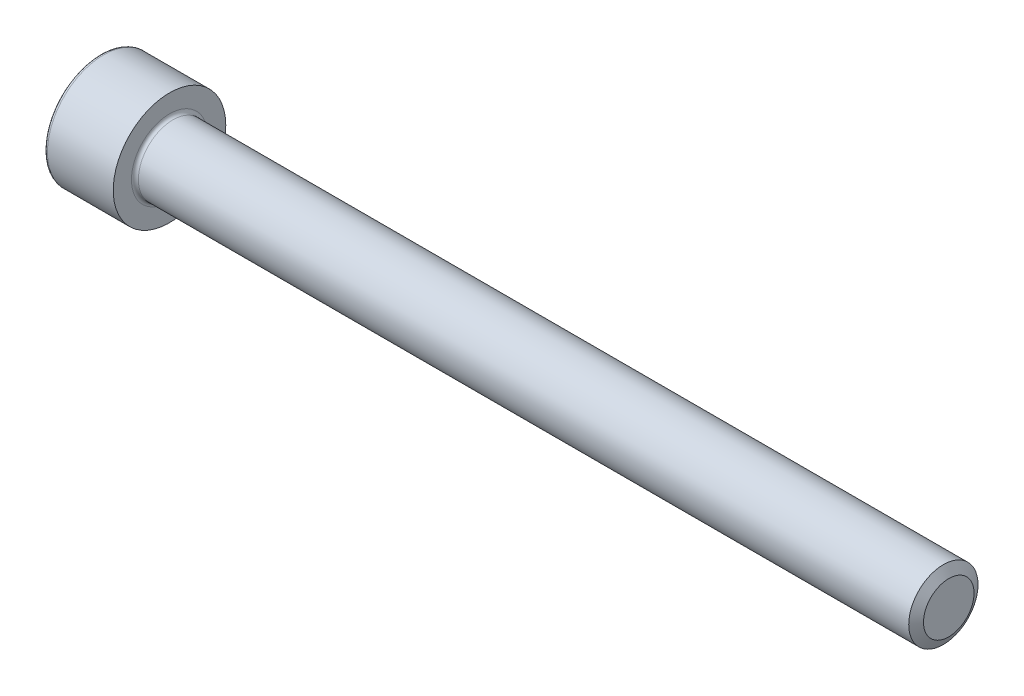
ISO-10303-21;
HEADER;
FILE_DESCRIPTION(('STEP AP214'),'2;1');
FILE_NAME('part.step','',(''),(''),'','','');
FILE_SCHEMA(('AUTOMOTIVE_DESIGN { 1 0 10303 214 1 1 1 1 }'));
ENDSEC;
DATA;
#1=APPLICATION_CONTEXT('core data for automotive mechanical design processes');
#2=APPLICATION_PROTOCOL_DEFINITION('international standard','automotive_design',2000,#1);
#3=PRODUCT_CONTEXT('',#1,'mechanical');
#4=PRODUCT('Part','Part','',(#3));
#5=PRODUCT_RELATED_PRODUCT_CATEGORY('part','',(#4));
#6=PRODUCT_DEFINITION_FORMATION('','',#4);
#7=PRODUCT_DEFINITION_CONTEXT('part definition',#1,'design');
#8=PRODUCT_DEFINITION('design','',#6,#7);
#9=PRODUCT_DEFINITION_SHAPE('','',#8);
#10=(LENGTH_UNIT() NAMED_UNIT(*) SI_UNIT(.MILLI.,.METRE.));
#11=(NAMED_UNIT(*) PLANE_ANGLE_UNIT() SI_UNIT($,.RADIAN.));
#12=(NAMED_UNIT(*) SI_UNIT($,.STERADIAN.) SOLID_ANGLE_UNIT());
#13=UNCERTAINTY_MEASURE_WITH_UNIT(LENGTH_MEASURE(1.E-05),#10,'distance_accuracy_value','');
#14=(GEOMETRIC_REPRESENTATION_CONTEXT(3) GLOBAL_UNCERTAINTY_ASSIGNED_CONTEXT((#13)) GLOBAL_UNIT_ASSIGNED_CONTEXT((#10,
#11,#12)) REPRESENTATION_CONTEXT('',''));
#15=CARTESIAN_POINT('',(0.,0.,0.));
#16=DIRECTION('',(0.,0.,1.));
#17=DIRECTION('',(1.,0.,0.));
#18=AXIS2_PLACEMENT_3D('',#15,#16,#17);
#19=CARTESIAN_POINT('',(0.,0.,0.));
#20=DIRECTION('',(1.,0.,0.));
#21=DIRECTION('',(0.,0.,-1.));
#22=AXIS2_PLACEMENT_3D('',#19,#20,#21);
#23=CYLINDRICAL_SURFACE('',#22,4.);
#24=CARTESIAN_POINT('',(8.4,0.,0.));
#25=DIRECTION('',(1.,0.,0.));
#26=DIRECTION('',(0.,0.,-1.));
#27=AXIS2_PLACEMENT_3D('',#24,#25,#26);
#28=CIRCLE('',#27,4.);
#29=CARTESIAN_POINT('',(8.4,0.,-4.));
#30=VERTEX_POINT('',#29);
#31=EDGE_CURVE('E120',#30,#30,#28,.T.);
#32=ORIENTED_EDGE('',*,*,#31,.T.);
#33=EDGE_LOOP('',(#32));
#34=FACE_BOUND('',#33,.T.);
#35=CARTESIAN_POINT('',(97.375,0.,0.));
#36=DIRECTION('',(-1.,0.,0.));
#37=DIRECTION('',(0.,0.,1.));
#38=AXIS2_PLACEMENT_3D('',#35,#36,#37);
#39=CIRCLE('',#38,4.);
#40=CARTESIAN_POINT('',(97.375,0.,4.));
#41=VERTEX_POINT('',#40);
#42=EDGE_CURVE('E309',#41,#41,#39,.T.);
#43=ORIENTED_EDGE('',*,*,#42,.T.);
#44=EDGE_LOOP('',(#43));
#45=FACE_BOUND('',#44,.T.);
#46=ADVANCED_FACE('F17',(#34,#45),#23,.T.);
#47=CARTESIAN_POINT('',(0.,0.,0.));
#48=DIRECTION('',(-1.,0.,0.));
#49=DIRECTION('',(0.,0.,1.));
#50=AXIS2_PLACEMENT_3D('',#47,#48,#49);
#51=PLANE('',#50);
#52=CARTESIAN_POINT('',(0.,0.,0.));
#53=DIRECTION('',(-1.,0.,0.));
#54=DIRECTION('',(0.,0.,1.));
#55=AXIS2_PLACEMENT_3D('',#52,#53,#54);
#56=CIRCLE('',#55,6.1);
#57=CARTESIAN_POINT('',(0.,0.,6.1));
#58=VERTEX_POINT('',#57);
#59=EDGE_CURVE('E11',#58,#58,#56,.T.);
#60=ORIENTED_EDGE('',*,*,#59,.T.);
#61=EDGE_LOOP('',(#60));
#62=FACE_BOUND('',#61,.T.);
#63=DIRECTION('',(0.,0.5,0.866025403784439));
#64=VECTOR('',#63,1.);
#65=CARTESIAN_POINT('',(0.,-3.43,0.));
#66=LINE('',#65,#64);
#67=CARTESIAN_POINT('',(0.,-3.43,0.));
#68=VERTEX_POINT('',#67);
#69=CARTESIAN_POINT('',(0.,-1.715,2.97046713498062));
#70=VERTEX_POINT('',#69);
#71=EDGE_CURVE('E32',#68,#70,#66,.T.);
#72=ORIENTED_EDGE('',*,*,#71,.F.);
#73=DIRECTION('',(0.,-0.5,0.866025403784439));
#74=VECTOR('',#73,1.);
#75=CARTESIAN_POINT('',(0.,-1.715,-2.97046713498062));
#76=LINE('',#75,#74);
#77=CARTESIAN_POINT('',(0.,-1.715,-2.97046713498062));
#78=VERTEX_POINT('',#77);
#79=EDGE_CURVE('E116',#78,#68,#76,.T.);
#80=ORIENTED_EDGE('',*,*,#79,.F.);
#81=DIRECTION('',(0.,-1.,0.));
#82=VECTOR('',#81,1.);
#83=CARTESIAN_POINT('',(0.,1.715,-2.97046713498062));
#84=LINE('',#83,#82);
#85=CARTESIAN_POINT('',(0.,1.715,-2.97046713498062));
#86=VERTEX_POINT('',#85);
#87=EDGE_CURVE('E114',#86,#78,#84,.T.);
#88=ORIENTED_EDGE('',*,*,#87,.F.);
#89=DIRECTION('',(0.,-0.5,-0.866025403784439));
#90=VECTOR('',#89,1.);
#91=CARTESIAN_POINT('',(0.,3.43,0.));
#92=LINE('',#91,#90);
#93=CARTESIAN_POINT('',(0.,3.43,0.));
#94=VERTEX_POINT('',#93);
#95=EDGE_CURVE('E80',#94,#86,#92,.T.);
#96=ORIENTED_EDGE('',*,*,#95,.F.);
#97=DIRECTION('',(0.,0.5,-0.866025403784439));
#98=VECTOR('',#97,1.);
#99=CARTESIAN_POINT('',(0.,1.715,2.97046713498062));
#100=LINE('',#99,#98);
#101=CARTESIAN_POINT('',(0.,1.715,2.97046713498062));
#102=VERTEX_POINT('',#101);
#103=EDGE_CURVE('E110',#102,#94,#100,.T.);
#104=ORIENTED_EDGE('',*,*,#103,.F.);
#105=DIRECTION('',(0.,1.,0.));
#106=VECTOR('',#105,1.);
#107=CARTESIAN_POINT('',(0.,-1.715,2.97046713498062));
#108=LINE('',#107,#106);
#109=EDGE_CURVE('E106',#70,#102,#108,.T.);
#110=ORIENTED_EDGE('',*,*,#109,.F.);
#111=EDGE_LOOP('',(#72,#80,#88,#96,#104,#110));
#112=FACE_BOUND('',#111,.T.);
#113=ADVANCED_FACE('F156',(#62,#112),#51,.T.);
#114=CARTESIAN_POINT('',(0.,0.,0.));
#115=DIRECTION('',(1.,0.,0.));
#116=DIRECTION('',(0.,0.,-1.));
#117=AXIS2_PLACEMENT_3D('',#114,#115,#116);
#118=CYLINDRICAL_SURFACE('',#117,6.5);
#119=CARTESIAN_POINT('',(0.4,0.,0.));
#120=DIRECTION('',(-1.,0.,0.));
#121=DIRECTION('',(0.,0.,1.));
#122=AXIS2_PLACEMENT_3D('',#119,#120,#121);
#123=CIRCLE('',#122,6.5);
#124=CARTESIAN_POINT('',(0.4,0.,6.5));
#125=VERTEX_POINT('',#124);
#126=EDGE_CURVE('E25',#125,#125,#123,.F.);
#127=ORIENTED_EDGE('',*,*,#126,.T.);
#128=EDGE_LOOP('',(#127));
#129=FACE_BOUND('',#128,.T.);
#130=CARTESIAN_POINT('',(8.,0.,0.));
#131=DIRECTION('',(1.,0.,0.));
#132=DIRECTION('',(0.,0.,-1.));
#133=AXIS2_PLACEMENT_3D('',#130,#131,#132);
#134=CIRCLE('',#133,6.5);
#135=CARTESIAN_POINT('',(8.,0.,-6.5));
#136=VERTEX_POINT('',#135);
#137=EDGE_CURVE('E131',#136,#136,#134,.T.);
#138=ORIENTED_EDGE('',*,*,#137,.F.);
#139=EDGE_LOOP('',(#138));
#140=FACE_BOUND('',#139,.T.);
#141=ADVANCED_FACE('F137',(#129,#140),#118,.T.);
#142=CARTESIAN_POINT('',(8.,6.5,0.));
#143=DIRECTION('',(1.,0.,0.));
#144=DIRECTION('',(0.,0.,-1.));
#145=AXIS2_PLACEMENT_3D('',#142,#143,#144);
#146=PLANE('',#145);
#147=ORIENTED_EDGE('',*,*,#137,.T.);
#148=EDGE_LOOP('',(#147));
#149=FACE_BOUND('',#148,.T.);
#150=CARTESIAN_POINT('',(8.,0.,0.));
#151=DIRECTION('',(1.,0.,0.));
#152=DIRECTION('',(0.,0.,-1.));
#153=AXIS2_PLACEMENT_3D('',#150,#151,#152);
#154=CIRCLE('',#153,4.4);
#155=CARTESIAN_POINT('',(8.,0.,-4.4));
#156=VERTEX_POINT('',#155);
#157=EDGE_CURVE('E128',#156,#156,#154,.T.);
#158=ORIENTED_EDGE('',*,*,#157,.F.);
#159=EDGE_LOOP('',(#158));
#160=FACE_BOUND('',#159,.T.);
#161=ADVANCED_FACE('F173',(#149,#160),#146,.T.);
#162=CARTESIAN_POINT('',(8.4,0.,0.));
#163=DIRECTION('',(1.,0.,0.));
#164=DIRECTION('',(0.,0.,-1.));
#165=AXIS2_PLACEMENT_3D('',#162,#163,#164);
#166=TOROIDAL_SURFACE('',#165,4.4,0.4);
#167=ORIENTED_EDGE('',*,*,#157,.T.);
#168=EDGE_LOOP('',(#167));
#169=FACE_BOUND('',#168,.T.);
#170=ORIENTED_EDGE('',*,*,#31,.F.);
#171=EDGE_LOOP('',(#170));
#172=FACE_BOUND('',#171,.T.);
#173=ADVANCED_FACE('F169',(#169,#172),#166,.F.);
#174=CARTESIAN_POINT('',(4.,-3.43,0.));
#175=DIRECTION('',(0.,-0.866025403784439,0.5));
#176=DIRECTION('',(0.,-0.5,-0.866025403784439));
#177=AXIS2_PLACEMENT_3D('',#174,#175,#176);
#178=PLANE('',#177);
#179=ORIENTED_EDGE('',*,*,#71,.T.);
#180=DIRECTION('',(-1.,0.,0.));
#181=VECTOR('',#180,1.);
#182=CARTESIAN_POINT('',(4.,-1.715,2.97046713498062));
#183=LINE('',#182,#181);
#184=CARTESIAN_POINT('',(4.,-1.715,2.97046713498062));
#185=VERTEX_POINT('',#184);
#186=EDGE_CURVE('E62',#185,#70,#183,.T.);
#187=ORIENTED_EDGE('',*,*,#186,.F.);
#188=DIRECTION('',(0.,0.5,0.866025403784439));
#189=VECTOR('',#188,1.);
#190=CARTESIAN_POINT('',(4.,-3.43,0.));
#191=LINE('',#190,#189);
#192=CARTESIAN_POINT('',(4.,-3.43,0.));
#193=VERTEX_POINT('',#192);
#194=EDGE_CURVE('E118',#193,#185,#191,.T.);
#195=ORIENTED_EDGE('',*,*,#194,.F.);
#196=DIRECTION('',(-1.,0.,0.));
#197=VECTOR('',#196,1.);
#198=CARTESIAN_POINT('',(4.,-3.43,0.));
#199=LINE('',#198,#197);
#200=EDGE_CURVE('E40',#193,#68,#199,.T.);
#201=ORIENTED_EDGE('',*,*,#200,.T.);
#202=EDGE_LOOP('',(#179,#187,#195,#201));
#203=FACE_BOUND('',#202,.T.);
#204=ADVANCED_FACE('F172',(#203),#178,.F.);
#205=CARTESIAN_POINT('',(4.,-1.715,-2.97046713498062));
#206=DIRECTION('',(0.,-0.866025403784439,-0.5));
#207=DIRECTION('',(0.,0.5,-0.866025403784439));
#208=AXIS2_PLACEMENT_3D('',#205,#206,#207);
#209=PLANE('',#208);
#210=ORIENTED_EDGE('',*,*,#79,.T.);
#211=ORIENTED_EDGE('',*,*,#200,.F.);
#212=DIRECTION('',(0.,-0.5,0.866025403784439));
#213=VECTOR('',#212,1.);
#214=CARTESIAN_POINT('',(4.,-1.715,-2.97046713498062));
#215=LINE('',#214,#213);
#216=CARTESIAN_POINT('',(4.,-1.715,-2.97046713498062));
#217=VERTEX_POINT('',#216);
#218=EDGE_CURVE('E92',#217,#193,#215,.T.);
#219=ORIENTED_EDGE('',*,*,#218,.F.);
#220=DIRECTION('',(-1.,0.,0.));
#221=VECTOR('',#220,1.);
#222=CARTESIAN_POINT('',(4.,-1.715,-2.97046713498062));
#223=LINE('',#222,#221);
#224=EDGE_CURVE('E84',#217,#78,#223,.T.);
#225=ORIENTED_EDGE('',*,*,#224,.T.);
#226=EDGE_LOOP('',(#210,#211,#219,#225));
#227=FACE_BOUND('',#226,.T.);
#228=ADVANCED_FACE('F205',(#227),#209,.F.);
#229=CARTESIAN_POINT('',(4.,1.715,-2.97046713498062));
#230=DIRECTION('',(0.,0.,-1.));
#231=DIRECTION('',(0.,1.,0.));
#232=AXIS2_PLACEMENT_3D('',#229,#230,#231);
#233=PLANE('',#232);
#234=ORIENTED_EDGE('',*,*,#87,.T.);
#235=ORIENTED_EDGE('',*,*,#224,.F.);
#236=DIRECTION('',(0.,-1.,0.));
#237=VECTOR('',#236,1.);
#238=CARTESIAN_POINT('',(4.,1.715,-2.97046713498062));
#239=LINE('',#238,#237);
#240=CARTESIAN_POINT('',(4.,1.715,-2.97046713498062));
#241=VERTEX_POINT('',#240);
#242=EDGE_CURVE('E88',#241,#217,#239,.T.);
#243=ORIENTED_EDGE('',*,*,#242,.F.);
#244=DIRECTION('',(-1.,0.,0.));
#245=VECTOR('',#244,1.);
#246=CARTESIAN_POINT('',(4.,1.715,-2.97046713498062));
#247=LINE('',#246,#245);
#248=EDGE_CURVE('E73',#241,#86,#247,.T.);
#249=ORIENTED_EDGE('',*,*,#248,.T.);
#250=EDGE_LOOP('',(#234,#235,#243,#249));
#251=FACE_BOUND('',#250,.T.);
#252=ADVANCED_FACE('F89',(#251),#233,.F.);
#253=CARTESIAN_POINT('',(4.,3.43,0.));
#254=DIRECTION('',(0.,0.866025403784439,-0.5));
#255=DIRECTION('',(0.,0.5,0.866025403784439));
#256=AXIS2_PLACEMENT_3D('',#253,#254,#255);
#257=PLANE('',#256);
#258=ORIENTED_EDGE('',*,*,#95,.T.);
#259=ORIENTED_EDGE('',*,*,#248,.F.);
#260=DIRECTION('',(0.,-0.5,-0.866025403784439));
#261=VECTOR('',#260,1.);
#262=CARTESIAN_POINT('',(4.,3.43,0.));
#263=LINE('',#262,#261);
#264=CARTESIAN_POINT('',(4.,3.43,0.));
#265=VERTEX_POINT('',#264);
#266=EDGE_CURVE('E77',#265,#241,#263,.T.);
#267=ORIENTED_EDGE('',*,*,#266,.F.);
#268=DIRECTION('',(-1.,0.,0.));
#269=VECTOR('',#268,1.);
#270=CARTESIAN_POINT('',(4.,3.43,0.));
#271=LINE('',#270,#269);
#272=EDGE_CURVE('E85',#265,#94,#271,.T.);
#273=ORIENTED_EDGE('',*,*,#272,.T.);
#274=EDGE_LOOP('',(#258,#259,#267,#273));
#275=FACE_BOUND('',#274,.T.);
#276=ADVANCED_FACE('F75',(#275),#257,.F.);
#277=CARTESIAN_POINT('',(4.,1.715,2.97046713498062));
#278=DIRECTION('',(0.,0.866025403784439,0.5));
#279=DIRECTION('',(0.,-0.5,0.866025403784439));
#280=AXIS2_PLACEMENT_3D('',#277,#278,#279);
#281=PLANE('',#280);
#282=ORIENTED_EDGE('',*,*,#103,.T.);
#283=ORIENTED_EDGE('',*,*,#272,.F.);
#284=DIRECTION('',(0.,0.5,-0.866025403784439));
#285=VECTOR('',#284,1.);
#286=CARTESIAN_POINT('',(4.,1.715,2.97046713498062));
#287=LINE('',#286,#285);
#288=CARTESIAN_POINT('',(4.,1.715,2.97046713498062));
#289=VERTEX_POINT('',#288);
#290=EDGE_CURVE('E98',#289,#265,#287,.T.);
#291=ORIENTED_EDGE('',*,*,#290,.F.);
#292=DIRECTION('',(-1.,0.,0.));
#293=VECTOR('',#292,1.);
#294=CARTESIAN_POINT('',(4.,1.715,2.97046713498062));
#295=LINE('',#294,#293);
#296=EDGE_CURVE('E123',#289,#102,#295,.T.);
#297=ORIENTED_EDGE('',*,*,#296,.T.);
#298=EDGE_LOOP('',(#282,#283,#291,#297));
#299=FACE_BOUND('',#298,.T.);
#300=ADVANCED_FACE('F226',(#299),#281,.F.);
#301=CARTESIAN_POINT('',(4.,-1.715,2.97046713498062));
#302=DIRECTION('',(0.,0.,1.));
#303=DIRECTION('',(0.,-1.,0.));
#304=AXIS2_PLACEMENT_3D('',#301,#302,#303);
#305=PLANE('',#304);
#306=ORIENTED_EDGE('',*,*,#109,.T.);
#307=ORIENTED_EDGE('',*,*,#296,.F.);
#308=DIRECTION('',(0.,1.,0.));
#309=VECTOR('',#308,1.);
#310=CARTESIAN_POINT('',(4.,-1.715,2.97046713498062));
#311=LINE('',#310,#309);
#312=EDGE_CURVE('E100',#185,#289,#311,.T.);
#313=ORIENTED_EDGE('',*,*,#312,.F.);
#314=ORIENTED_EDGE('',*,*,#186,.T.);
#315=EDGE_LOOP('',(#306,#307,#313,#314));
#316=FACE_BOUND('',#315,.T.);
#317=ADVANCED_FACE('F152',(#316),#305,.F.);
#318=CARTESIAN_POINT('',(4.,-1.715,2.97046713498062));
#319=DIRECTION('',(-1.,0.,0.));
#320=DIRECTION('',(0.,0.,1.));
#321=AXIS2_PLACEMENT_3D('',#318,#319,#320);
#322=PLANE('',#321);
#323=ORIENTED_EDGE('',*,*,#194,.T.);
#324=ORIENTED_EDGE('',*,*,#312,.T.);
#325=ORIENTED_EDGE('',*,*,#290,.T.);
#326=ORIENTED_EDGE('',*,*,#266,.T.);
#327=ORIENTED_EDGE('',*,*,#242,.T.);
#328=ORIENTED_EDGE('',*,*,#218,.T.);
#329=EDGE_LOOP('',(#323,#324,#325,#326,#327,#328));
#330=FACE_BOUND('',#329,.T.);
#331=ADVANCED_FACE('F95',(#330),#322,.T.);
#332=CARTESIAN_POINT('',(0.4,0.,0.));
#333=DIRECTION('',(-1.,0.,0.));
#334=DIRECTION('',(0.,0.,1.));
#335=AXIS2_PLACEMENT_3D('',#332,#333,#334);
#336=TOROIDAL_SURFACE('',#335,6.1,0.4);
#337=ORIENTED_EDGE('',*,*,#59,.F.);
#338=EDGE_LOOP('',(#337));
#339=FACE_BOUND('',#338,.T.);
#340=ORIENTED_EDGE('',*,*,#126,.F.);
#341=EDGE_LOOP('',(#340));
#342=FACE_BOUND('',#341,.T.);
#343=ADVANCED_FACE('F19',(#339,#342),#336,.T.);
#344=CARTESIAN_POINT('',(97.375,0.,0.));
#345=DIRECTION('',(-1.,0.,0.));
#346=DIRECTION('',(0.,0.,1.));
#347=AXIS2_PLACEMENT_3D('',#344,#345,#346);
#348=CONICAL_SURFACE('',#347,4.,1.04718484902493);
#349=CARTESIAN_POINT('',(98.,0.,0.));
#350=DIRECTION('',(-1.,0.,0.));
#351=DIRECTION('',(0.,0.,1.));
#352=AXIS2_PLACEMENT_3D('',#349,#350,#351);
#353=CIRCLE('',#352,2.9175);
#354=CARTESIAN_POINT('',(98.,0.,2.9175));
#355=VERTEX_POINT('',#354);
#356=EDGE_CURVE('E107',#355,#355,#353,.T.);
#357=ORIENTED_EDGE('',*,*,#356,.T.);
#358=EDGE_LOOP('',(#357));
#359=FACE_BOUND('',#358,.T.);
#360=ORIENTED_EDGE('',*,*,#42,.F.);
#361=EDGE_LOOP('',(#360));
#362=FACE_BOUND('',#361,.T.);
#363=ADVANCED_FACE('F141',(#359,#362),#348,.T.);
#364=CARTESIAN_POINT('',(98.,4.,0.));
#365=DIRECTION('',(1.,0.,0.));
#366=DIRECTION('',(0.,0.,-1.));
#367=AXIS2_PLACEMENT_3D('',#364,#365,#366);
#368=PLANE('',#367);
#369=ORIENTED_EDGE('',*,*,#356,.F.);
#370=EDGE_LOOP('',(#369));
#371=FACE_BOUND('',#370,.T.);
#372=ADVANCED_FACE('F149',(#371),#368,.T.);
#373=CLOSED_SHELL('',(#46,#113,#141,#161,#173,#204,#228,#252,#276,#300,#317,#331,#343,#363,#372));
#374=MANIFOLD_SOLID_BREP('B1',#373);
#375=ADVANCED_BREP_SHAPE_REPRESENTATION('',(#18,#374),#14);
#376=SHAPE_DEFINITION_REPRESENTATION(#9,#375);
ENDSEC;
END-ISO-10303-21;
